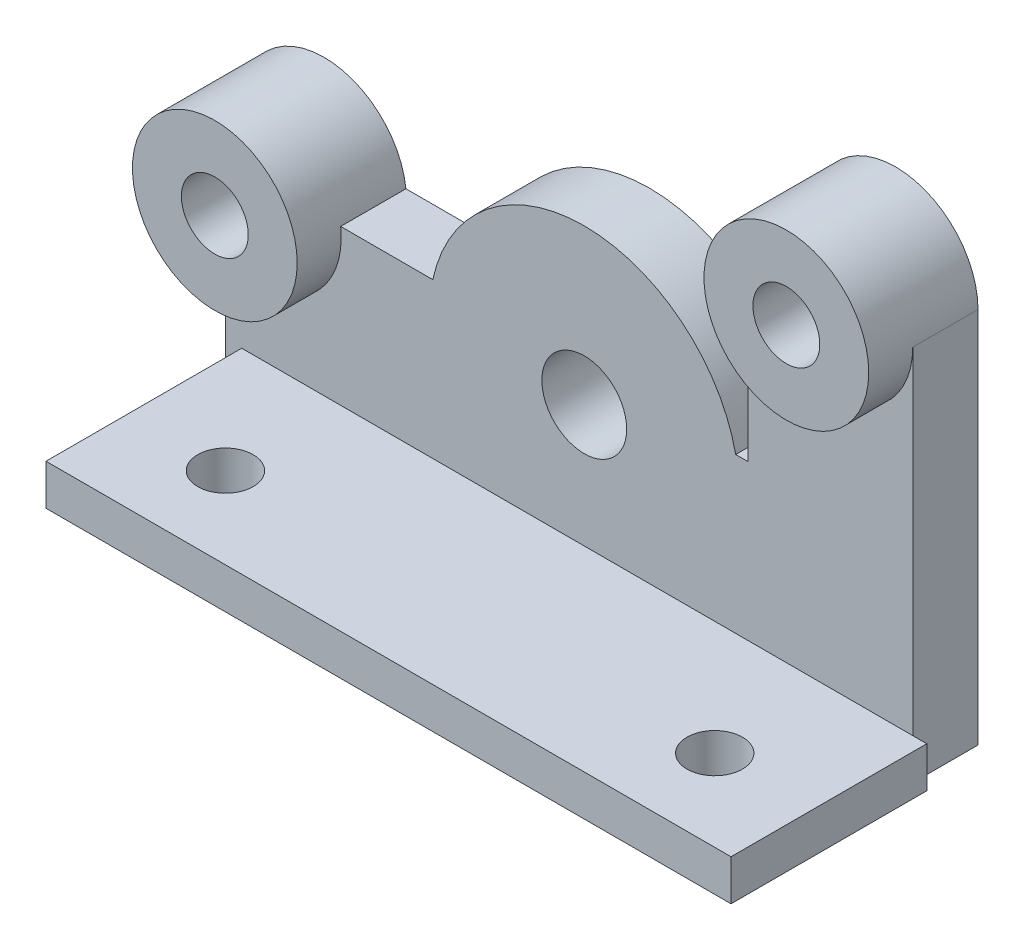
ISO-10303-21;
HEADER;
FILE_DESCRIPTION(('STEP AP214'),'2;1');
FILE_NAME('part.step','',(''),(''),'','','');
FILE_SCHEMA(('AUTOMOTIVE_DESIGN { 1 0 10303 214 1 1 1 1 }'));
ENDSEC;
DATA;
#1=APPLICATION_CONTEXT('core data for automotive mechanical design processes');
#2=APPLICATION_PROTOCOL_DEFINITION('international standard','automotive_design',2000,#1);
#3=PRODUCT_CONTEXT('',#1,'mechanical');
#4=PRODUCT('Part','Part','',(#3));
#5=PRODUCT_RELATED_PRODUCT_CATEGORY('part','',(#4));
#6=PRODUCT_DEFINITION_FORMATION('','',#4);
#7=PRODUCT_DEFINITION_CONTEXT('part definition',#1,'design');
#8=PRODUCT_DEFINITION('design','',#6,#7);
#9=PRODUCT_DEFINITION_SHAPE('','',#8);
#10=(LENGTH_UNIT() NAMED_UNIT(*) SI_UNIT(.MILLI.,.METRE.));
#11=(NAMED_UNIT(*) PLANE_ANGLE_UNIT() SI_UNIT($,.RADIAN.));
#12=(NAMED_UNIT(*) SI_UNIT($,.STERADIAN.) SOLID_ANGLE_UNIT());
#13=UNCERTAINTY_MEASURE_WITH_UNIT(LENGTH_MEASURE(1.E-05),#10,'distance_accuracy_value','');
#14=(GEOMETRIC_REPRESENTATION_CONTEXT(3) GLOBAL_UNCERTAINTY_ASSIGNED_CONTEXT((#13)) GLOBAL_UNIT_ASSIGNED_CONTEXT((#10,
#11,#12)) REPRESENTATION_CONTEXT('',''));
#15=CARTESIAN_POINT('',(0.,0.,0.));
#16=DIRECTION('',(0.,0.,1.));
#17=DIRECTION('',(1.,0.,0.));
#18=AXIS2_PLACEMENT_3D('',#15,#16,#17);
#19=CARTESIAN_POINT('',(310.040923202436,53.1249395007438,362.5));
#20=DIRECTION('',(1.,0.,0.));
#21=DIRECTION('',(0.,0.,-1.));
#22=AXIS2_PLACEMENT_3D('',#19,#20,#21);
#23=PLANE('',#22);
#24=DIRECTION('',(0.,0.,-1.));
#25=VECTOR('',#24,1.);
#26=CARTESIAN_POINT('',(310.040923202436,42.,362.5));
#27=LINE('',#26,#25);
#28=CARTESIAN_POINT('',(310.040923202436,42.,362.5));
#29=VERTEX_POINT('',#28);
#30=CARTESIAN_POINT('',(310.040923202436,42.,358.5));
#31=VERTEX_POINT('',#30);
#32=EDGE_CURVE('E43',#29,#31,#27,.T.);
#33=ORIENTED_EDGE('',*,*,#32,.F.);
#34=DIRECTION('',(0.,-1.,0.));
#35=VECTOR('',#34,1.);
#36=CARTESIAN_POINT('',(310.040923202436,53.1249395007438,362.5));
#37=LINE('',#36,#35);
#38=CARTESIAN_POINT('',(310.040923202436,53.1249395007438,362.5));
#39=VERTEX_POINT('',#38);
#40=EDGE_CURVE('E240',#39,#29,#37,.T.);
#41=ORIENTED_EDGE('',*,*,#40,.F.);
#42=DIRECTION('',(0.,0.,-1.));
#43=VECTOR('',#42,1.);
#44=CARTESIAN_POINT('',(310.040923202436,53.1249395007438,362.5));
#45=LINE('',#44,#43);
#46=CARTESIAN_POINT('',(310.040923202436,53.1249395007438,358.5));
#47=VERTEX_POINT('',#46);
#48=EDGE_CURVE('E249',#39,#47,#45,.T.);
#49=ORIENTED_EDGE('',*,*,#48,.T.);
#50=DIRECTION('',(0.,-1.,0.));
#51=VECTOR('',#50,1.);
#52=CARTESIAN_POINT('',(310.040923202436,53.1249395007438,358.5));
#53=LINE('',#52,#51);
#54=EDGE_CURVE('E239',#47,#31,#53,.T.);
#55=ORIENTED_EDGE('',*,*,#54,.T.);
#56=EDGE_LOOP('',(#33,#41,#49,#55));
#57=FACE_BOUND('',#56,.T.);
#58=ADVANCED_FACE('F39',(#57),#23,.F.);
#59=CARTESIAN_POINT('',(315.090923202436,53.1249395007438,362.5));
#60=DIRECTION('',(0.,0.,-1.));
#61=DIRECTION('',(-1.,0.,0.));
#62=AXIS2_PLACEMENT_3D('',#59,#60,#61);
#63=CYLINDRICAL_SURFACE('',#62,5.05);
#64=ORIENTED_EDGE('',*,*,#48,.F.);
#65=CARTESIAN_POINT('',(315.090923202436,53.1249395007438,362.5));
#66=DIRECTION('',(0.,0.,1.));
#67=DIRECTION('',(1.,0.,0.));
#68=AXIS2_PLACEMENT_3D('',#65,#66,#67);
#69=CIRCLE('',#68,5.05);
#70=CARTESIAN_POINT('',(320.140923202436,53.1249395007438,362.5));
#71=VERTEX_POINT('',#70);
#72=EDGE_CURVE('E163',#39,#71,#69,.T.);
#73=ORIENTED_EDGE('',*,*,#72,.T.);
#74=DIRECTION('',(0.,0.,-1.));
#75=VECTOR('',#74,1.);
#76=CARTESIAN_POINT('',(320.140923202436,53.1249395007438,362.5));
#77=LINE('',#76,#75);
#78=CARTESIAN_POINT('',(320.140923202436,53.1249395007438,358.5));
#79=VERTEX_POINT('',#78);
#80=EDGE_CURVE('E257',#71,#79,#77,.T.);
#81=ORIENTED_EDGE('',*,*,#80,.T.);
#82=CARTESIAN_POINT('',(315.090923202436,53.1249395007438,358.5));
#83=DIRECTION('',(0.,0.,1.));
#84=DIRECTION('',(1.,0.,0.));
#85=AXIS2_PLACEMENT_3D('',#82,#83,#84);
#86=CIRCLE('',#85,5.05);
#87=EDGE_CURVE('E262',#79,#47,#86,.T.);
#88=ORIENTED_EDGE('',*,*,#87,.T.);
#89=EDGE_LOOP('',(#64,#73,#81,#88));
#90=FACE_BOUND('',#89,.T.);
#91=CARTESIAN_POINT('',(315.090923202436,53.1249395007438,365.2));
#92=DIRECTION('',(0.,0.,1.));
#93=DIRECTION('',(1.,0.,0.));
#94=AXIS2_PLACEMENT_3D('',#91,#92,#93);
#95=CIRCLE('',#94,5.05);
#96=CARTESIAN_POINT('',(320.140923202436,53.1249395007438,365.2));
#97=VERTEX_POINT('',#96);
#98=EDGE_CURVE('E167',#97,#97,#95,.T.);
#99=ORIENTED_EDGE('',*,*,#98,.F.);
#100=EDGE_LOOP('',(#99));
#101=FACE_BOUND('',#100,.T.);
#102=ADVANCED_FACE('F41',(#90,#101),#63,.T.);
#103=CARTESIAN_POINT('',(315.090923202436,53.1249395007438,362.5));
#104=DIRECTION('',(0.,0.,1.));
#105=DIRECTION('',(1.,0.,0.));
#106=AXIS2_PLACEMENT_3D('',#103,#104,#105);
#107=PLANE('',#106);
#108=DIRECTION('',(0.,1.,0.));
#109=VECTOR('',#108,1.);
#110=CARTESIAN_POINT('',(320.140923202436,30.,362.5));
#111=LINE('',#110,#109);
#112=CARTESIAN_POINT('',(320.140923202436,32.5,362.5));
#113=VERTEX_POINT('',#112);
#114=EDGE_CURVE('E245',#113,#71,#111,.T.);
#115=ORIENTED_EDGE('',*,*,#114,.T.);
#116=ORIENTED_EDGE('',*,*,#72,.F.);
#117=ORIENTED_EDGE('',*,*,#40,.T.);
#118=DIRECTION('',(-1.,0.,0.));
#119=VECTOR('',#118,1.);
#120=CARTESIAN_POINT('',(319.,42.,362.5));
#121=LINE('',#120,#119);
#122=CARTESIAN_POINT('',(309.287087810503,42.,362.5));
#123=VERTEX_POINT('',#122);
#124=EDGE_CURVE('E233',#29,#123,#121,.T.);
#125=ORIENTED_EDGE('',*,*,#124,.T.);
#126=CARTESIAN_POINT('',(300.,40.,362.5));
#127=DIRECTION('',(0.,0.,1.));
#128=DIRECTION('',(1.,0.,0.));
#129=AXIS2_PLACEMENT_3D('',#126,#127,#128);
#130=CIRCLE('',#129,9.50000000000001);
#131=CARTESIAN_POINT('',(290.712912189497,42.,362.5));
#132=VERTEX_POINT('',#131);
#133=EDGE_CURVE('E224',#123,#132,#130,.T.);
#134=ORIENTED_EDGE('',*,*,#133,.T.);
#135=CARTESIAN_POINT('',(285.067510983456,42.,362.5));
#136=VERTEX_POINT('',#135);
#137=EDGE_CURVE('E155',#132,#136,#121,.T.);
#138=ORIENTED_EDGE('',*,*,#137,.T.);
#139=CARTESIAN_POINT('',(280.050647311647,41.4224371043051,362.5));
#140=DIRECTION('',(0.,0.,1.));
#141=DIRECTION('',(1.,0.,0.));
#142=AXIS2_PLACEMENT_3D('',#139,#140,#141);
#143=CIRCLE('',#142,5.05);
#144=CARTESIAN_POINT('',(278.,36.8075323812111,362.5));
#145=VERTEX_POINT('',#144);
#146=EDGE_CURVE('E143',#145,#136,#143,.T.);
#147=ORIENTED_EDGE('',*,*,#146,.F.);
#148=DIRECTION('',(0.,-1.,0.));
#149=VECTOR('',#148,1.);
#150=CARTESIAN_POINT('',(278.,42.,362.5));
#151=LINE('',#150,#149);
#152=CARTESIAN_POINT('',(278.,30.,362.5));
#153=VERTEX_POINT('',#152);
#154=EDGE_CURVE('E151',#145,#153,#151,.T.);
#155=ORIENTED_EDGE('',*,*,#154,.T.);
#156=DIRECTION('',(1.,0.,0.));
#157=VECTOR('',#156,1.);
#158=CARTESIAN_POINT('',(310.040923202436,30.,362.5));
#159=LINE('',#158,#157);
#160=CARTESIAN_POINT('',(279.,30.,362.5));
#161=VERTEX_POINT('',#160);
#162=EDGE_CURVE('E60',#153,#161,#159,.T.);
#163=ORIENTED_EDGE('',*,*,#162,.T.);
#164=DIRECTION('',(0.,-1.,0.));
#165=VECTOR('',#164,1.);
#166=CARTESIAN_POINT('',(279.,32.5,362.5));
#167=LINE('',#166,#165);
#168=CARTESIAN_POINT('',(279.,32.5,362.5));
#169=VERTEX_POINT('',#168);
#170=EDGE_CURVE('E196',#169,#161,#167,.T.);
#171=ORIENTED_EDGE('',*,*,#170,.F.);
#172=DIRECTION('',(-1.,0.,0.));
#173=VECTOR('',#172,1.);
#174=CARTESIAN_POINT('',(279.,32.5,362.5));
#175=LINE('',#174,#173);
#176=EDGE_CURVE('E11',#113,#169,#175,.T.);
#177=ORIENTED_EDGE('',*,*,#176,.F.);
#178=EDGE_LOOP('',(#115,#116,#117,#125,#134,#138,#147,#155,#163,#171,#177));
#179=FACE_BOUND('',#178,.T.);
#180=CARTESIAN_POINT('',(300.,40.,362.5));
#181=DIRECTION('',(0.,0.,1.));
#182=DIRECTION('',(1.,0.,0.));
#183=AXIS2_PLACEMENT_3D('',#180,#181,#182);
#184=CIRCLE('',#183,2.59999999999999);
#185=CARTESIAN_POINT('',(302.6,40.,362.5));
#186=VERTEX_POINT('',#185);
#187=EDGE_CURVE('E218',#186,#186,#184,.T.);
#188=ORIENTED_EDGE('',*,*,#187,.F.);
#189=EDGE_LOOP('',(#188));
#190=FACE_BOUND('',#189,.T.);
#191=ADVANCED_FACE('F159',(#179,#190),#107,.T.);
#192=CARTESIAN_POINT('',(315.090923202436,53.1249395007438,358.5));
#193=DIRECTION('',(0.,0.,1.));
#194=DIRECTION('',(1.,0.,0.));
#195=AXIS2_PLACEMENT_3D('',#192,#193,#194);
#196=PLANE('',#195);
#197=CARTESIAN_POINT('',(315.090923202436,53.1249395007438,358.5));
#198=DIRECTION('',(0.,0.,1.));
#199=DIRECTION('',(1.,0.,0.));
#200=AXIS2_PLACEMENT_3D('',#197,#198,#199);
#201=CIRCLE('',#200,2.05);
#202=CARTESIAN_POINT('',(313.040923202436,53.1249395007438,358.5));
#203=VERTEX_POINT('',#202);
#204=EDGE_CURVE('E328',#203,#203,#201,.T.);
#205=ORIENTED_EDGE('',*,*,#204,.T.);
#206=EDGE_LOOP('',(#205));
#207=FACE_BOUND('',#206,.T.);
#208=CARTESIAN_POINT('',(280.050647311647,41.4224371043051,358.5));
#209=DIRECTION('',(0.,0.,1.));
#210=DIRECTION('',(1.,0.,0.));
#211=AXIS2_PLACEMENT_3D('',#208,#209,#210);
#212=CIRCLE('',#211,2.05);
#213=CARTESIAN_POINT('',(278.000647311647,41.4224371043051,358.5));
#214=VERTEX_POINT('',#213);
#215=EDGE_CURVE('E332',#214,#214,#212,.T.);
#216=ORIENTED_EDGE('',*,*,#215,.T.);
#217=EDGE_LOOP('',(#216));
#218=FACE_BOUND('',#217,.T.);
#219=CARTESIAN_POINT('',(300.,40.,358.5));
#220=DIRECTION('',(0.,0.,1.));
#221=DIRECTION('',(1.,0.,0.));
#222=AXIS2_PLACEMENT_3D('',#219,#220,#221);
#223=CIRCLE('',#222,2.59999999999999);
#224=CARTESIAN_POINT('',(302.6,40.,358.5));
#225=VERTEX_POINT('',#224);
#226=EDGE_CURVE('E217',#225,#225,#223,.T.);
#227=ORIENTED_EDGE('',*,*,#226,.T.);
#228=EDGE_LOOP('',(#227));
#229=FACE_BOUND('',#228,.T.);
#230=DIRECTION('',(1.,0.,0.));
#231=VECTOR('',#230,1.);
#232=CARTESIAN_POINT('',(310.040923202436,30.,358.5));
#233=LINE('',#232,#231);
#234=CARTESIAN_POINT('',(278.,30.,358.5));
#235=VERTEX_POINT('',#234);
#236=CARTESIAN_POINT('',(320.140923202436,30.,358.5));
#237=VERTEX_POINT('',#236);
#238=EDGE_CURVE('E251',#235,#237,#233,.T.);
#239=ORIENTED_EDGE('',*,*,#238,.F.);
#240=DIRECTION('',(0.,-1.,0.));
#241=VECTOR('',#240,1.);
#242=CARTESIAN_POINT('',(278.,42.,358.5));
#243=LINE('',#242,#241);
#244=CARTESIAN_POINT('',(278.,36.8075323812111,358.5));
#245=VERTEX_POINT('',#244);
#246=EDGE_CURVE('E231',#245,#235,#243,.T.);
#247=ORIENTED_EDGE('',*,*,#246,.F.);
#248=CARTESIAN_POINT('',(280.050647311647,41.4224371043051,358.5));
#249=DIRECTION('',(0.,0.,1.));
#250=DIRECTION('',(1.,0.,0.));
#251=AXIS2_PLACEMENT_3D('',#248,#249,#250);
#252=CIRCLE('',#251,5.05);
#253=CARTESIAN_POINT('',(285.067510983456,42.,358.5));
#254=VERTEX_POINT('',#253);
#255=EDGE_CURVE('E145',#254,#245,#252,.T.);
#256=ORIENTED_EDGE('',*,*,#255,.F.);
#257=DIRECTION('',(-1.,0.,0.));
#258=VECTOR('',#257,1.);
#259=CARTESIAN_POINT('',(319.,42.,358.5));
#260=LINE('',#259,#258);
#261=CARTESIAN_POINT('',(290.712912189497,42.,358.5));
#262=VERTEX_POINT('',#261);
#263=EDGE_CURVE('E236',#262,#254,#260,.T.);
#264=ORIENTED_EDGE('',*,*,#263,.F.);
#265=CARTESIAN_POINT('',(300.,40.,358.5));
#266=DIRECTION('',(0.,0.,1.));
#267=DIRECTION('',(1.,0.,0.));
#268=AXIS2_PLACEMENT_3D('',#265,#266,#267);
#269=CIRCLE('',#268,9.50000000000001);
#270=CARTESIAN_POINT('',(309.287087810503,42.,358.5));
#271=VERTEX_POINT('',#270);
#272=EDGE_CURVE('E221',#271,#262,#269,.T.);
#273=ORIENTED_EDGE('',*,*,#272,.F.);
#274=EDGE_CURVE('E156',#31,#271,#260,.T.);
#275=ORIENTED_EDGE('',*,*,#274,.F.);
#276=ORIENTED_EDGE('',*,*,#54,.F.);
#277=ORIENTED_EDGE('',*,*,#87,.F.);
#278=DIRECTION('',(0.,1.,0.));
#279=VECTOR('',#278,1.);
#280=CARTESIAN_POINT('',(320.140923202436,30.,358.5));
#281=LINE('',#280,#279);
#282=EDGE_CURVE('E243',#237,#79,#281,.T.);
#283=ORIENTED_EDGE('',*,*,#282,.F.);
#284=EDGE_LOOP('',(#239,#247,#256,#264,#273,#275,#276,#277,#283));
#285=FACE_BOUND('',#284,.T.);
#286=ADVANCED_FACE('F275',(#207,#218,#229,#285),#196,.F.);
#287=CARTESIAN_POINT('',(310.040923202436,30.,362.5));
#288=DIRECTION('',(0.,1.,0.));
#289=DIRECTION('',(0.,0.,1.));
#290=AXIS2_PLACEMENT_3D('',#287,#288,#289);
#291=PLANE('',#290);
#292=ORIENTED_EDGE('',*,*,#238,.T.);
#293=DIRECTION('',(0.,0.,-1.));
#294=VECTOR('',#293,1.);
#295=CARTESIAN_POINT('',(320.140923202436,30.,362.5));
#296=LINE('',#295,#294);
#297=CARTESIAN_POINT('',(320.140923202436,30.,362.5));
#298=VERTEX_POINT('',#297);
#299=EDGE_CURVE('E260',#298,#237,#296,.T.);
#300=ORIENTED_EDGE('',*,*,#299,.F.);
#301=DIRECTION('',(-1.,0.,0.));
#302=VECTOR('',#301,1.);
#303=CARTESIAN_POINT('',(279.,30.,362.5));
#304=LINE('',#303,#302);
#305=CARTESIAN_POINT('',(321.,30.,362.5));
#306=VERTEX_POINT('',#305);
#307=EDGE_CURVE('E191',#306,#298,#304,.T.);
#308=ORIENTED_EDGE('',*,*,#307,.F.);
#309=DIRECTION('',(0.,0.,-1.));
#310=VECTOR('',#309,1.);
#311=CARTESIAN_POINT('',(321.,30.,362.5));
#312=LINE('',#311,#310);
#313=CARTESIAN_POINT('',(321.,30.,374.5));
#314=VERTEX_POINT('',#313);
#315=EDGE_CURVE('E201',#314,#306,#312,.T.);
#316=ORIENTED_EDGE('',*,*,#315,.F.);
#317=DIRECTION('',(1.,0.,0.));
#318=VECTOR('',#317,1.);
#319=CARTESIAN_POINT('',(321.,30.,374.5));
#320=LINE('',#319,#318);
#321=CARTESIAN_POINT('',(279.,30.,374.5));
#322=VERTEX_POINT('',#321);
#323=EDGE_CURVE('E199',#322,#314,#320,.T.);
#324=ORIENTED_EDGE('',*,*,#323,.F.);
#325=DIRECTION('',(0.,0.,1.));
#326=VECTOR('',#325,1.);
#327=CARTESIAN_POINT('',(279.,30.,374.5));
#328=LINE('',#327,#326);
#329=EDGE_CURVE('E184',#161,#322,#328,.T.);
#330=ORIENTED_EDGE('',*,*,#329,.F.);
#331=ORIENTED_EDGE('',*,*,#162,.F.);
#332=DIRECTION('',(0.,0.,-1.));
#333=VECTOR('',#332,1.);
#334=CARTESIAN_POINT('',(278.,30.,362.5));
#335=LINE('',#334,#333);
#336=EDGE_CURVE('E154',#153,#235,#335,.T.);
#337=ORIENTED_EDGE('',*,*,#336,.T.);
#338=EDGE_LOOP('',(#292,#300,#308,#316,#324,#330,#331,#337));
#339=FACE_BOUND('',#338,.T.);
#340=CARTESIAN_POINT('',(285.,30.,369.5));
#341=DIRECTION('',(0.,1.,0.));
#342=DIRECTION('',(0.,0.,1.));
#343=AXIS2_PLACEMENT_3D('',#340,#341,#342);
#344=CIRCLE('',#343,1.69999999999998);
#345=CARTESIAN_POINT('',(285.,30.,371.2));
#346=VERTEX_POINT('',#345);
#347=EDGE_CURVE('E177',#346,#346,#344,.T.);
#348=ORIENTED_EDGE('',*,*,#347,.T.);
#349=EDGE_LOOP('',(#348));
#350=FACE_BOUND('',#349,.T.);
#351=CARTESIAN_POINT('',(315.,30.,369.5));
#352=DIRECTION('',(0.,1.,0.));
#353=DIRECTION('',(0.,0.,1.));
#354=AXIS2_PLACEMENT_3D('',#351,#352,#353);
#355=CIRCLE('',#354,1.69999999999998);
#356=CARTESIAN_POINT('',(315.,30.,371.2));
#357=VERTEX_POINT('',#356);
#358=EDGE_CURVE('E178',#357,#357,#355,.T.);
#359=ORIENTED_EDGE('',*,*,#358,.T.);
#360=EDGE_LOOP('',(#359));
#361=FACE_BOUND('',#360,.T.);
#362=ADVANCED_FACE('F285',(#339,#350,#361),#291,.F.);
#363=CARTESIAN_POINT('',(320.140923202436,30.,362.5));
#364=DIRECTION('',(-1.,0.,0.));
#365=DIRECTION('',(0.,0.,1.));
#366=AXIS2_PLACEMENT_3D('',#363,#364,#365);
#367=PLANE('',#366);
#368=ORIENTED_EDGE('',*,*,#282,.T.);
#369=ORIENTED_EDGE('',*,*,#80,.F.);
#370=ORIENTED_EDGE('',*,*,#114,.F.);
#371=EDGE_CURVE('E246',#298,#113,#111,.T.);
#372=ORIENTED_EDGE('',*,*,#371,.F.);
#373=ORIENTED_EDGE('',*,*,#299,.T.);
#374=EDGE_LOOP('',(#368,#369,#370,#372,#373));
#375=FACE_BOUND('',#374,.T.);
#376=ADVANCED_FACE('F304',(#375),#367,.F.);
#377=CARTESIAN_POINT('',(319.,42.,362.5));
#378=DIRECTION('',(0.,-1.,0.));
#379=DIRECTION('',(0.,0.,-1.));
#380=AXIS2_PLACEMENT_3D('',#377,#378,#379);
#381=PLANE('',#380);
#382=ORIENTED_EDGE('',*,*,#124,.F.);
#383=ORIENTED_EDGE('',*,*,#32,.T.);
#384=ORIENTED_EDGE('',*,*,#274,.T.);
#385=DIRECTION('',(0.,0.,-1.));
#386=VECTOR('',#385,1.);
#387=CARTESIAN_POINT('',(309.287087810503,42.,362.5));
#388=LINE('',#387,#386);
#389=EDGE_CURVE('E226',#123,#271,#388,.T.);
#390=ORIENTED_EDGE('',*,*,#389,.F.);
#391=EDGE_LOOP('',(#382,#383,#384,#390));
#392=FACE_BOUND('',#391,.T.);
#393=ADVANCED_FACE('F269',(#392),#381,.F.);
#394=DIRECTION('',(0.,0.,-1.));
#395=VECTOR('',#394,1.);
#396=CARTESIAN_POINT('',(285.067510983456,42.,362.5));
#397=LINE('',#396,#395);
#398=EDGE_CURVE('E148',#136,#254,#397,.T.);
#399=ORIENTED_EDGE('',*,*,#398,.F.);
#400=ORIENTED_EDGE('',*,*,#137,.F.);
#401=DIRECTION('',(0.,0.,-1.));
#402=VECTOR('',#401,1.);
#403=CARTESIAN_POINT('',(290.712912189497,42.,362.5));
#404=LINE('',#403,#402);
#405=EDGE_CURVE('E230',#262,#132,#404,.F.);
#406=ORIENTED_EDGE('',*,*,#405,.F.);
#407=ORIENTED_EDGE('',*,*,#263,.T.);
#408=EDGE_LOOP('',(#399,#400,#406,#407));
#409=FACE_BOUND('',#408,.T.);
#410=ADVANCED_FACE('F282',(#409),#381,.F.);
#411=CARTESIAN_POINT('',(278.,42.,362.5));
#412=DIRECTION('',(1.,0.,0.));
#413=DIRECTION('',(0.,0.,-1.));
#414=AXIS2_PLACEMENT_3D('',#411,#412,#413);
#415=PLANE('',#414);
#416=DIRECTION('',(0.,0.,-1.));
#417=VECTOR('',#416,1.);
#418=CARTESIAN_POINT('',(278.,36.8075323812111,362.5));
#419=LINE('',#418,#417);
#420=EDGE_CURVE('E137',#245,#145,#419,.F.);
#421=ORIENTED_EDGE('',*,*,#420,.F.);
#422=ORIENTED_EDGE('',*,*,#246,.T.);
#423=ORIENTED_EDGE('',*,*,#336,.F.);
#424=ORIENTED_EDGE('',*,*,#154,.F.);
#425=EDGE_LOOP('',(#421,#422,#423,#424));
#426=FACE_BOUND('',#425,.T.);
#427=ADVANCED_FACE('F152',(#426),#415,.F.);
#428=CARTESIAN_POINT('',(300.,40.,362.5));
#429=DIRECTION('',(0.,0.,-1.));
#430=DIRECTION('',(-1.,0.,0.));
#431=AXIS2_PLACEMENT_3D('',#428,#429,#430);
#432=CYLINDRICAL_SURFACE('',#431,9.50000000000001);
#433=ORIENTED_EDGE('',*,*,#272,.T.);
#434=ORIENTED_EDGE('',*,*,#405,.T.);
#435=ORIENTED_EDGE('',*,*,#133,.F.);
#436=ORIENTED_EDGE('',*,*,#389,.T.);
#437=EDGE_LOOP('',(#433,#434,#435,#436));
#438=FACE_BOUND('',#437,.T.);
#439=ADVANCED_FACE('F279',(#438),#432,.T.);
#440=CARTESIAN_POINT('',(300.,40.,362.5));
#441=DIRECTION('',(0.,0.,-1.));
#442=DIRECTION('',(-1.,0.,0.));
#443=AXIS2_PLACEMENT_3D('',#440,#441,#442);
#444=CYLINDRICAL_SURFACE('',#443,2.59999999999999);
#445=ORIENTED_EDGE('',*,*,#187,.T.);
#446=EDGE_LOOP('',(#445));
#447=FACE_BOUND('',#446,.T.);
#448=ORIENTED_EDGE('',*,*,#226,.F.);
#449=EDGE_LOOP('',(#448));
#450=FACE_BOUND('',#449,.T.);
#451=ADVANCED_FACE('F335',(#447,#450),#444,.F.);
#452=CARTESIAN_POINT('',(280.050647311647,41.4224371043051,362.5));
#453=DIRECTION('',(0.,0.,-1.));
#454=DIRECTION('',(-1.,0.,0.));
#455=AXIS2_PLACEMENT_3D('',#452,#453,#454);
#456=CYLINDRICAL_SURFACE('',#455,5.05);
#457=ORIENTED_EDGE('',*,*,#420,.T.);
#458=ORIENTED_EDGE('',*,*,#146,.T.);
#459=ORIENTED_EDGE('',*,*,#398,.T.);
#460=ORIENTED_EDGE('',*,*,#255,.T.);
#461=EDGE_LOOP('',(#457,#458,#459,#460));
#462=FACE_BOUND('',#461,.T.);
#463=CARTESIAN_POINT('',(280.050647311647,41.4224371043051,365.2));
#464=DIRECTION('',(0.,0.,1.));
#465=DIRECTION('',(1.,0.,0.));
#466=AXIS2_PLACEMENT_3D('',#463,#464,#465);
#467=CIRCLE('',#466,5.05);
#468=CARTESIAN_POINT('',(285.100647311647,41.4224371043051,365.2));
#469=VERTEX_POINT('',#468);
#470=EDGE_CURVE('E164',#469,#469,#467,.T.);
#471=ORIENTED_EDGE('',*,*,#470,.F.);
#472=EDGE_LOOP('',(#471));
#473=FACE_BOUND('',#472,.T.);
#474=ADVANCED_FACE('F139',(#462,#473),#456,.T.);
#475=CARTESIAN_POINT('',(279.,32.5,362.5));
#476=DIRECTION('',(0.,0.,1.));
#477=DIRECTION('',(1.,0.,0.));
#478=AXIS2_PLACEMENT_3D('',#475,#476,#477);
#479=PLANE('',#478);
#480=ORIENTED_EDGE('',*,*,#307,.T.);
#481=ORIENTED_EDGE('',*,*,#371,.T.);
#482=CARTESIAN_POINT('',(321.,32.5,362.5));
#483=VERTEX_POINT('',#482);
#484=EDGE_CURVE('E49',#483,#113,#175,.T.);
#485=ORIENTED_EDGE('',*,*,#484,.F.);
#486=DIRECTION('',(0.,-1.,0.));
#487=VECTOR('',#486,1.);
#488=CARTESIAN_POINT('',(321.,32.5,362.5));
#489=LINE('',#488,#487);
#490=EDGE_CURVE('E206',#483,#306,#489,.T.);
#491=ORIENTED_EDGE('',*,*,#490,.T.);
#492=EDGE_LOOP('',(#480,#481,#485,#491));
#493=FACE_BOUND('',#492,.T.);
#494=ADVANCED_FACE('F300',(#493),#479,.F.);
#495=CARTESIAN_POINT('',(0.,32.5,0.));
#496=DIRECTION('',(0.,-1.,0.));
#497=DIRECTION('',(0.,0.,-1.));
#498=AXIS2_PLACEMENT_3D('',#495,#496,#497);
#499=PLANE('',#498);
#500=DIRECTION('',(0.,0.,1.));
#501=VECTOR('',#500,1.);
#502=CARTESIAN_POINT('',(279.,32.5,374.5));
#503=LINE('',#502,#501);
#504=CARTESIAN_POINT('',(279.,32.5,374.5));
#505=VERTEX_POINT('',#504);
#506=EDGE_CURVE('E187',#169,#505,#503,.T.);
#507=ORIENTED_EDGE('',*,*,#506,.T.);
#508=DIRECTION('',(1.,0.,0.));
#509=VECTOR('',#508,1.);
#510=CARTESIAN_POINT('',(321.,32.5,374.5));
#511=LINE('',#510,#509);
#512=CARTESIAN_POINT('',(321.,32.5,374.5));
#513=VERTEX_POINT('',#512);
#514=EDGE_CURVE('E190',#505,#513,#511,.T.);
#515=ORIENTED_EDGE('',*,*,#514,.T.);
#516=DIRECTION('',(0.,0.,-1.));
#517=VECTOR('',#516,1.);
#518=CARTESIAN_POINT('',(321.,32.5,362.5));
#519=LINE('',#518,#517);
#520=EDGE_CURVE('E193',#513,#483,#519,.T.);
#521=ORIENTED_EDGE('',*,*,#520,.T.);
#522=ORIENTED_EDGE('',*,*,#484,.T.);
#523=ORIENTED_EDGE('',*,*,#176,.T.);
#524=EDGE_LOOP('',(#507,#515,#521,#522,#523));
#525=FACE_BOUND('',#524,.T.);
#526=CARTESIAN_POINT('',(285.,32.5,369.5));
#527=DIRECTION('',(0.,1.,0.));
#528=DIRECTION('',(0.,0.,1.));
#529=AXIS2_PLACEMENT_3D('',#526,#527,#528);
#530=CIRCLE('',#529,1.69999999999998);
#531=CARTESIAN_POINT('',(285.,32.5,371.2));
#532=VERTEX_POINT('',#531);
#533=EDGE_CURVE('E181',#532,#532,#530,.T.);
#534=ORIENTED_EDGE('',*,*,#533,.F.);
#535=EDGE_LOOP('',(#534));
#536=FACE_BOUND('',#535,.T.);
#537=CARTESIAN_POINT('',(315.,32.5,369.5));
#538=DIRECTION('',(0.,1.,0.));
#539=DIRECTION('',(0.,0.,1.));
#540=AXIS2_PLACEMENT_3D('',#537,#538,#539);
#541=CIRCLE('',#540,1.69999999999998);
#542=CARTESIAN_POINT('',(315.,32.5,371.2));
#543=VERTEX_POINT('',#542);
#544=EDGE_CURVE('E174',#543,#543,#541,.T.);
#545=ORIENTED_EDGE('',*,*,#544,.F.);
#546=EDGE_LOOP('',(#545));
#547=FACE_BOUND('',#546,.T.);
#548=ADVANCED_FACE('F294',(#525,#536,#547),#499,.F.);
#549=CARTESIAN_POINT('',(279.,32.5,374.5));
#550=DIRECTION('',(1.,0.,0.));
#551=DIRECTION('',(0.,0.,-1.));
#552=AXIS2_PLACEMENT_3D('',#549,#550,#551);
#553=PLANE('',#552);
#554=ORIENTED_EDGE('',*,*,#329,.T.);
#555=DIRECTION('',(0.,-1.,0.));
#556=VECTOR('',#555,1.);
#557=CARTESIAN_POINT('',(279.,32.5,374.5));
#558=LINE('',#557,#556);
#559=EDGE_CURVE('E212',#505,#322,#558,.T.);
#560=ORIENTED_EDGE('',*,*,#559,.F.);
#561=ORIENTED_EDGE('',*,*,#506,.F.);
#562=ORIENTED_EDGE('',*,*,#170,.T.);
#563=EDGE_LOOP('',(#554,#560,#561,#562));
#564=FACE_BOUND('',#563,.T.);
#565=ADVANCED_FACE('F291',(#564),#553,.F.);
#566=CARTESIAN_POINT('',(321.,32.5,374.5));
#567=DIRECTION('',(0.,0.,-1.));
#568=DIRECTION('',(-1.,0.,0.));
#569=AXIS2_PLACEMENT_3D('',#566,#567,#568);
#570=PLANE('',#569);
#571=ORIENTED_EDGE('',*,*,#323,.T.);
#572=DIRECTION('',(0.,-1.,0.));
#573=VECTOR('',#572,1.);
#574=CARTESIAN_POINT('',(321.,32.5,374.5));
#575=LINE('',#574,#573);
#576=EDGE_CURVE('E209',#513,#314,#575,.T.);
#577=ORIENTED_EDGE('',*,*,#576,.F.);
#578=ORIENTED_EDGE('',*,*,#514,.F.);
#579=ORIENTED_EDGE('',*,*,#559,.T.);
#580=EDGE_LOOP('',(#571,#577,#578,#579));
#581=FACE_BOUND('',#580,.T.);
#582=ADVANCED_FACE('F437',(#581),#570,.F.);
#583=CARTESIAN_POINT('',(321.,32.5,362.5));
#584=DIRECTION('',(-1.,0.,0.));
#585=DIRECTION('',(0.,0.,1.));
#586=AXIS2_PLACEMENT_3D('',#583,#584,#585);
#587=PLANE('',#586);
#588=ORIENTED_EDGE('',*,*,#315,.T.);
#589=ORIENTED_EDGE('',*,*,#490,.F.);
#590=ORIENTED_EDGE('',*,*,#520,.F.);
#591=ORIENTED_EDGE('',*,*,#576,.T.);
#592=EDGE_LOOP('',(#588,#589,#590,#591));
#593=FACE_BOUND('',#592,.T.);
#594=ADVANCED_FACE('F429',(#593),#587,.F.);
#595=CARTESIAN_POINT('',(285.,32.5,369.5));
#596=DIRECTION('',(0.,-1.,0.));
#597=DIRECTION('',(0.,0.,-1.));
#598=AXIS2_PLACEMENT_3D('',#595,#596,#597);
#599=CYLINDRICAL_SURFACE('',#598,1.69999999999998);
#600=ORIENTED_EDGE('',*,*,#533,.T.);
#601=EDGE_LOOP('',(#600));
#602=FACE_BOUND('',#601,.T.);
#603=ORIENTED_EDGE('',*,*,#347,.F.);
#604=EDGE_LOOP('',(#603));
#605=FACE_BOUND('',#604,.T.);
#606=ADVANCED_FACE('F425',(#602,#605),#599,.F.);
#607=CARTESIAN_POINT('',(315.,32.5,369.5));
#608=DIRECTION('',(0.,-1.,0.));
#609=DIRECTION('',(0.,0.,-1.));
#610=AXIS2_PLACEMENT_3D('',#607,#608,#609);
#611=CYLINDRICAL_SURFACE('',#610,1.69999999999998);
#612=ORIENTED_EDGE('',*,*,#544,.T.);
#613=EDGE_LOOP('',(#612));
#614=FACE_BOUND('',#613,.T.);
#615=ORIENTED_EDGE('',*,*,#358,.F.);
#616=EDGE_LOOP('',(#615));
#617=FACE_BOUND('',#616,.T.);
#618=ADVANCED_FACE('F387',(#614,#617),#611,.F.);
#619=CARTESIAN_POINT('',(280.050647311647,41.4224371043051,365.2));
#620=DIRECTION('',(0.,0.,1.));
#621=DIRECTION('',(1.,0.,0.));
#622=AXIS2_PLACEMENT_3D('',#619,#620,#621);
#623=PLANE('',#622);
#624=CARTESIAN_POINT('',(280.050647311647,41.4224371043051,365.2));
#625=DIRECTION('',(0.,0.,1.));
#626=DIRECTION('',(1.,0.,0.));
#627=AXIS2_PLACEMENT_3D('',#624,#625,#626);
#628=CIRCLE('',#627,2.05);
#629=CARTESIAN_POINT('',(278.000647311647,41.4224371043051,365.2));
#630=VERTEX_POINT('',#629);
#631=EDGE_CURVE('E568',#630,#630,#628,.T.);
#632=ORIENTED_EDGE('',*,*,#631,.F.);
#633=EDGE_LOOP('',(#632));
#634=FACE_BOUND('',#633,.T.);
#635=ORIENTED_EDGE('',*,*,#470,.T.);
#636=EDGE_LOOP('',(#635));
#637=FACE_BOUND('',#636,.T.);
#638=ADVANCED_FACE('F381',(#634,#637),#623,.T.);
#639=CARTESIAN_POINT('',(315.090923202436,53.1249395007438,365.2));
#640=DIRECTION('',(0.,0.,1.));
#641=DIRECTION('',(1.,0.,0.));
#642=AXIS2_PLACEMENT_3D('',#639,#640,#641);
#643=PLANE('',#642);
#644=CARTESIAN_POINT('',(315.090923202436,53.1249395007438,365.2));
#645=DIRECTION('',(0.,0.,1.));
#646=DIRECTION('',(1.,0.,0.));
#647=AXIS2_PLACEMENT_3D('',#644,#645,#646);
#648=CIRCLE('',#647,2.05);
#649=CARTESIAN_POINT('',(313.040923202436,53.1249395007438,365.2));
#650=VERTEX_POINT('',#649);
#651=EDGE_CURVE('E170',#650,#650,#648,.T.);
#652=ORIENTED_EDGE('',*,*,#651,.F.);
#653=EDGE_LOOP('',(#652));
#654=FACE_BOUND('',#653,.T.);
#655=ORIENTED_EDGE('',*,*,#98,.T.);
#656=EDGE_LOOP('',(#655));
#657=FACE_BOUND('',#656,.T.);
#658=ADVANCED_FACE('F386',(#654,#657),#643,.T.);
#659=CARTESIAN_POINT('',(315.090923202436,53.1249395007438,365.2));
#660=DIRECTION('',(0.,0.,-1.));
#661=DIRECTION('',(-1.,0.,0.));
#662=AXIS2_PLACEMENT_3D('',#659,#660,#661);
#663=CYLINDRICAL_SURFACE('',#662,2.05);
#664=CARTESIAN_POINT('',(313.040923202436,53.1249395007438,365.2));
#665=CARTESIAN_POINT('',(313.040923202436,53.1249395007438,365.130208333333));
#666=CARTESIAN_POINT('',(313.040923202436,53.1249395007438,365.060416666667));
#667=CARTESIAN_POINT('',(313.040923202436,53.1249395007438,364.920833333333));
#668=CARTESIAN_POINT('',(313.040923202436,53.1249395007438,364.851041666667));
#669=CARTESIAN_POINT('',(313.040923202436,53.1249395007438,364.711458333333));
#670=CARTESIAN_POINT('',(313.040923202436,53.1249395007438,364.641666666667));
#671=CARTESIAN_POINT('',(313.040923202436,53.1249395007438,364.502083333333));
#672=CARTESIAN_POINT('',(313.040923202436,53.1249395007438,364.432291666667));
#673=CARTESIAN_POINT('',(313.040923202436,53.1249395007438,364.292708333333));
#674=CARTESIAN_POINT('',(313.040923202436,53.1249395007438,364.222916666667));
#675=CARTESIAN_POINT('',(313.040923202436,53.1249395007438,364.083333333333));
#676=CARTESIAN_POINT('',(313.040923202436,53.1249395007438,364.013541666667));
#677=CARTESIAN_POINT('',(313.040923202436,53.1249395007438,363.873958333333));
#678=CARTESIAN_POINT('',(313.040923202436,53.1249395007438,363.804166666667));
#679=CARTESIAN_POINT('',(313.040923202436,53.1249395007438,363.664583333333));
#680=CARTESIAN_POINT('',(313.040923202436,53.1249395007438,363.594791666667));
#681=CARTESIAN_POINT('',(313.040923202436,53.1249395007438,363.455208333333));
#682=CARTESIAN_POINT('',(313.040923202436,53.1249395007438,363.385416666667));
#683=CARTESIAN_POINT('',(313.040923202436,53.1249395007438,363.245833333333));
#684=CARTESIAN_POINT('',(313.040923202436,53.1249395007438,363.176041666667));
#685=CARTESIAN_POINT('',(313.040923202436,53.1249395007438,363.036458333333));
#686=CARTESIAN_POINT('',(313.040923202436,53.1249395007438,362.966666666667));
#687=CARTESIAN_POINT('',(313.040923202436,53.1249395007438,362.827083333333));
#688=CARTESIAN_POINT('',(313.040923202436,53.1249395007438,362.757291666667));
#689=CARTESIAN_POINT('',(313.040923202436,53.1249395007438,362.617708333333));
#690=CARTESIAN_POINT('',(313.040923202436,53.1249395007438,362.547916666667));
#691=CARTESIAN_POINT('',(313.040923202436,53.1249395007438,362.408333333333));
#692=CARTESIAN_POINT('',(313.040923202436,53.1249395007438,362.338541666667));
#693=CARTESIAN_POINT('',(313.040923202436,53.1249395007438,362.198958333333));
#694=CARTESIAN_POINT('',(313.040923202436,53.1249395007438,362.129166666667));
#695=CARTESIAN_POINT('',(313.040923202436,53.1249395007438,361.989583333333));
#696=CARTESIAN_POINT('',(313.040923202436,53.1249395007438,361.919791666667));
#697=CARTESIAN_POINT('',(313.040923202436,53.1249395007438,361.780208333333));
#698=CARTESIAN_POINT('',(313.040923202436,53.1249395007438,361.710416666667));
#699=CARTESIAN_POINT('',(313.040923202436,53.1249395007438,361.570833333333));
#700=CARTESIAN_POINT('',(313.040923202436,53.1249395007438,361.501041666667));
#701=CARTESIAN_POINT('',(313.040923202436,53.1249395007438,361.361458333333));
#702=CARTESIAN_POINT('',(313.040923202436,53.1249395007438,361.291666666667));
#703=CARTESIAN_POINT('',(313.040923202436,53.1249395007438,361.152083333333));
#704=CARTESIAN_POINT('',(313.040923202436,53.1249395007438,361.082291666667));
#705=CARTESIAN_POINT('',(313.040923202436,53.1249395007438,360.942708333333));
#706=CARTESIAN_POINT('',(313.040923202436,53.1249395007438,360.872916666667));
#707=CARTESIAN_POINT('',(313.040923202436,53.1249395007438,360.733333333333));
#708=CARTESIAN_POINT('',(313.040923202436,53.1249395007438,360.663541666667));
#709=CARTESIAN_POINT('',(313.040923202436,53.1249395007438,360.523958333333));
#710=CARTESIAN_POINT('',(313.040923202436,53.1249395007438,360.454166666667));
#711=CARTESIAN_POINT('',(313.040923202436,53.1249395007438,360.314583333333));
#712=CARTESIAN_POINT('',(313.040923202436,53.1249395007438,360.244791666667));
#713=CARTESIAN_POINT('',(313.040923202436,53.1249395007438,360.105208333333));
#714=CARTESIAN_POINT('',(313.040923202436,53.1249395007438,360.035416666667));
#715=CARTESIAN_POINT('',(313.040923202436,53.1249395007438,359.895833333333));
#716=CARTESIAN_POINT('',(313.040923202436,53.1249395007438,359.826041666667));
#717=CARTESIAN_POINT('',(313.040923202436,53.1249395007438,359.686458333333));
#718=CARTESIAN_POINT('',(313.040923202436,53.1249395007438,359.616666666667));
#719=CARTESIAN_POINT('',(313.040923202436,53.1249395007438,359.477083333333));
#720=CARTESIAN_POINT('',(313.040923202436,53.1249395007438,359.407291666667));
#721=CARTESIAN_POINT('',(313.040923202436,53.1249395007438,359.267708333333));
#722=CARTESIAN_POINT('',(313.040923202436,53.1249395007438,359.197916666667));
#723=CARTESIAN_POINT('',(313.040923202436,53.1249395007438,359.058333333333));
#724=CARTESIAN_POINT('',(313.040923202436,53.1249395007438,358.988541666667));
#725=CARTESIAN_POINT('',(313.040923202436,53.1249395007438,358.848958333333));
#726=CARTESIAN_POINT('',(313.040923202436,53.1249395007438,358.779166666667));
#727=CARTESIAN_POINT('',(313.040923202436,53.1249395007438,358.639583333333));
#728=CARTESIAN_POINT('',(313.040923202436,53.1249395007438,358.569791666667));
#729=CARTESIAN_POINT('',(313.040923202436,53.1249395007438,358.5));
#730=B_SPLINE_CURVE_WITH_KNOTS('',3,(#664,#665,#666,#667,#668,#669,#670,#671,#672,#673,#674,
#675,#676,#677,#678,#679,#680,#681,#682,#683,#684,#685,#686,#687,#688,#689,#690,#691,#692,#693,
#694,#695,#696,#697,#698,#699,#700,#701,#702,#703,#704,#705,#706,#707,#708,#709,#710,#711,#712,
#713,#714,#715,#716,#717,#718,#719,#720,#721,#722,#723,#724,#725,#726,#727,#728,#729),
.UNSPECIFIED.,.F.,.F.,(4,2,2,2,2,2,2,2,2,2,2,2,2,2,2,2,2,2,2,2,2,2,2,2,2,2,2,2,2,2,2,2,4),(0.,
0.209374999999956,0.418749999999968,0.628124999999979,0.837499999999991,1.04687499999995,
1.25624999999996,1.46562499999997,1.67499999999998,1.88437499999999,2.09374999999995,
2.30312499999996,2.51249999999997,2.72187499999998,2.93124999999994,3.14062499999995,
3.34999999999996,3.55937499999998,3.76874999999999,3.97812499999994,4.18749999999996,
4.39687499999997,4.60624999999998,4.81562499999993,5.02499999999995,5.23437499999996,
5.44374999999997,5.65312499999998,5.86249999999994,6.07187499999995,6.28124999999996,
6.49062499999997,6.69999999999993),.UNSPECIFIED.);
#731=EDGE_CURVE('BSEAM398',#650,#203,#730,.T.);
#732=ORIENTED_EDGE('',*,*,#651,.T.);
#733=ORIENTED_EDGE('',*,*,#204,.F.);
#734=ORIENTED_EDGE('',*,*,#731,.T.);
#735=ORIENTED_EDGE('',*,*,#731,.F.);
#736=EDGE_LOOP('',(#732,#734,#733,#735));
#737=FACE_BOUND('',#736,.T.);
#738=ADVANCED_FACE('F398',(#737),#663,.F.);
#739=CARTESIAN_POINT('',(280.050647311647,41.4224371043051,365.2));
#740=DIRECTION('',(0.,0.,-1.));
#741=DIRECTION('',(-1.,0.,0.));
#742=AXIS2_PLACEMENT_3D('',#739,#740,#741);
#743=CYLINDRICAL_SURFACE('',#742,2.05);
#744=CARTESIAN_POINT('',(278.000647311647,41.4224371043051,365.2));
#745=CARTESIAN_POINT('',(278.000647311647,41.4224371043051,365.130208333333));
#746=CARTESIAN_POINT('',(278.000647311647,41.4224371043051,365.060416666667));
#747=CARTESIAN_POINT('',(278.000647311647,41.4224371043051,364.920833333333));
#748=CARTESIAN_POINT('',(278.000647311647,41.4224371043051,364.851041666667));
#749=CARTESIAN_POINT('',(278.000647311647,41.4224371043051,364.711458333333));
#750=CARTESIAN_POINT('',(278.000647311647,41.4224371043051,364.641666666667));
#751=CARTESIAN_POINT('',(278.000647311647,41.4224371043051,364.502083333333));
#752=CARTESIAN_POINT('',(278.000647311647,41.4224371043051,364.432291666667));
#753=CARTESIAN_POINT('',(278.000647311647,41.4224371043051,364.292708333333));
#754=CARTESIAN_POINT('',(278.000647311647,41.4224371043051,364.222916666667));
#755=CARTESIAN_POINT('',(278.000647311647,41.4224371043051,364.083333333333));
#756=CARTESIAN_POINT('',(278.000647311647,41.4224371043051,364.013541666667));
#757=CARTESIAN_POINT('',(278.000647311647,41.4224371043051,363.873958333333));
#758=CARTESIAN_POINT('',(278.000647311647,41.4224371043051,363.804166666667));
#759=CARTESIAN_POINT('',(278.000647311647,41.4224371043051,363.664583333333));
#760=CARTESIAN_POINT('',(278.000647311647,41.4224371043051,363.594791666667));
#761=CARTESIAN_POINT('',(278.000647311647,41.4224371043051,363.455208333333));
#762=CARTESIAN_POINT('',(278.000647311647,41.4224371043051,363.385416666667));
#763=CARTESIAN_POINT('',(278.000647311647,41.4224371043051,363.245833333333));
#764=CARTESIAN_POINT('',(278.000647311647,41.4224371043051,363.176041666667));
#765=CARTESIAN_POINT('',(278.000647311647,41.4224371043051,363.036458333333));
#766=CARTESIAN_POINT('',(278.000647311647,41.4224371043051,362.966666666667));
#767=CARTESIAN_POINT('',(278.000647311647,41.4224371043051,362.827083333333));
#768=CARTESIAN_POINT('',(278.000647311647,41.4224371043051,362.757291666667));
#769=CARTESIAN_POINT('',(278.000647311647,41.4224371043051,362.617708333333));
#770=CARTESIAN_POINT('',(278.000647311647,41.4224371043051,362.547916666667));
#771=CARTESIAN_POINT('',(278.000647311647,41.4224371043051,362.408333333333));
#772=CARTESIAN_POINT('',(278.000647311647,41.4224371043051,362.338541666667));
#773=CARTESIAN_POINT('',(278.000647311647,41.4224371043051,362.198958333333));
#774=CARTESIAN_POINT('',(278.000647311647,41.4224371043051,362.129166666667));
#775=CARTESIAN_POINT('',(278.000647311647,41.4224371043051,361.989583333333));
#776=CARTESIAN_POINT('',(278.000647311647,41.4224371043051,361.919791666667));
#777=CARTESIAN_POINT('',(278.000647311647,41.4224371043051,361.780208333333));
#778=CARTESIAN_POINT('',(278.000647311647,41.4224371043051,361.710416666667));
#779=CARTESIAN_POINT('',(278.000647311647,41.4224371043051,361.570833333333));
#780=CARTESIAN_POINT('',(278.000647311647,41.4224371043051,361.501041666667));
#781=CARTESIAN_POINT('',(278.000647311647,41.4224371043051,361.361458333333));
#782=CARTESIAN_POINT('',(278.000647311647,41.4224371043051,361.291666666667));
#783=CARTESIAN_POINT('',(278.000647311647,41.4224371043051,361.152083333333));
#784=CARTESIAN_POINT('',(278.000647311647,41.4224371043051,361.082291666667));
#785=CARTESIAN_POINT('',(278.000647311647,41.4224371043051,360.942708333333));
#786=CARTESIAN_POINT('',(278.000647311647,41.4224371043051,360.872916666667));
#787=CARTESIAN_POINT('',(278.000647311647,41.4224371043051,360.733333333333));
#788=CARTESIAN_POINT('',(278.000647311647,41.4224371043051,360.663541666667));
#789=CARTESIAN_POINT('',(278.000647311647,41.4224371043051,360.523958333333));
#790=CARTESIAN_POINT('',(278.000647311647,41.4224371043051,360.454166666667));
#791=CARTESIAN_POINT('',(278.000647311647,41.4224371043051,360.314583333333));
#792=CARTESIAN_POINT('',(278.000647311647,41.4224371043051,360.244791666667));
#793=CARTESIAN_POINT('',(278.000647311647,41.4224371043051,360.105208333333));
#794=CARTESIAN_POINT('',(278.000647311647,41.4224371043051,360.035416666667));
#795=CARTESIAN_POINT('',(278.000647311647,41.4224371043051,359.895833333333));
#796=CARTESIAN_POINT('',(278.000647311647,41.4224371043051,359.826041666667));
#797=CARTESIAN_POINT('',(278.000647311647,41.4224371043051,359.686458333333));
#798=CARTESIAN_POINT('',(278.000647311647,41.4224371043051,359.616666666667));
#799=CARTESIAN_POINT('',(278.000647311647,41.4224371043051,359.477083333333));
#800=CARTESIAN_POINT('',(278.000647311647,41.4224371043051,359.407291666667));
#801=CARTESIAN_POINT('',(278.000647311647,41.4224371043051,359.267708333333));
#802=CARTESIAN_POINT('',(278.000647311647,41.4224371043051,359.197916666667));
#803=CARTESIAN_POINT('',(278.000647311647,41.4224371043051,359.058333333333));
#804=CARTESIAN_POINT('',(278.000647311647,41.4224371043051,358.988541666667));
#805=CARTESIAN_POINT('',(278.000647311647,41.4224371043051,358.848958333333));
#806=CARTESIAN_POINT('',(278.000647311647,41.4224371043051,358.779166666667));
#807=CARTESIAN_POINT('',(278.000647311647,41.4224371043051,358.639583333333));
#808=CARTESIAN_POINT('',(278.000647311647,41.4224371043051,358.569791666667));
#809=CARTESIAN_POINT('',(278.000647311647,41.4224371043051,358.5));
#810=B_SPLINE_CURVE_WITH_KNOTS('',3,(#744,#745,#746,#747,#748,#749,#750,#751,#752,#753,#754,
#755,#756,#757,#758,#759,#760,#761,#762,#763,#764,#765,#766,#767,#768,#769,#770,#771,#772,#773,
#774,#775,#776,#777,#778,#779,#780,#781,#782,#783,#784,#785,#786,#787,#788,#789,#790,#791,#792,
#793,#794,#795,#796,#797,#798,#799,#800,#801,#802,#803,#804,#805,#806,#807,#808,#809),
.UNSPECIFIED.,.F.,.F.,(4,2,2,2,2,2,2,2,2,2,2,2,2,2,2,2,2,2,2,2,2,2,2,2,2,2,2,2,2,2,2,2,4),(0.,
0.209374999999956,0.418749999999968,0.628124999999979,0.837499999999991,1.04687499999995,
1.25624999999996,1.46562499999997,1.67499999999998,1.88437499999999,2.09374999999995,
2.30312499999996,2.51249999999997,2.72187499999998,2.93124999999994,3.14062499999995,
3.34999999999996,3.55937499999998,3.76874999999999,3.97812499999994,4.18749999999996,
4.39687499999997,4.60624999999998,4.81562499999993,5.02499999999995,5.23437499999996,
5.44374999999997,5.65312499999998,5.86249999999994,6.07187499999995,6.28124999999996,
6.49062499999997,6.69999999999993),.UNSPECIFIED.);
#811=EDGE_CURVE('BSEAM408',#630,#214,#810,.T.);
#812=ORIENTED_EDGE('',*,*,#631,.T.);
#813=ORIENTED_EDGE('',*,*,#215,.F.);
#814=ORIENTED_EDGE('',*,*,#811,.T.);
#815=ORIENTED_EDGE('',*,*,#811,.F.);
#816=EDGE_LOOP('',(#812,#814,#813,#815));
#817=FACE_BOUND('',#816,.T.);
#818=ADVANCED_FACE('F408',(#817),#743,.F.);
#819=CLOSED_SHELL('',(#58,#102,#191,#286,#362,#376,#393,#410,#427,#439,#451,#474,#494,#548,#565,
#582,#594,#606,#618,#638,#658,#738,#818));
#820=MANIFOLD_SOLID_BREP('B2',#819);
#821=ADVANCED_BREP_SHAPE_REPRESENTATION('',(#18,#820),#14);
#822=SHAPE_DEFINITION_REPRESENTATION(#9,#821);
ENDSEC;
END-ISO-10303-21;
